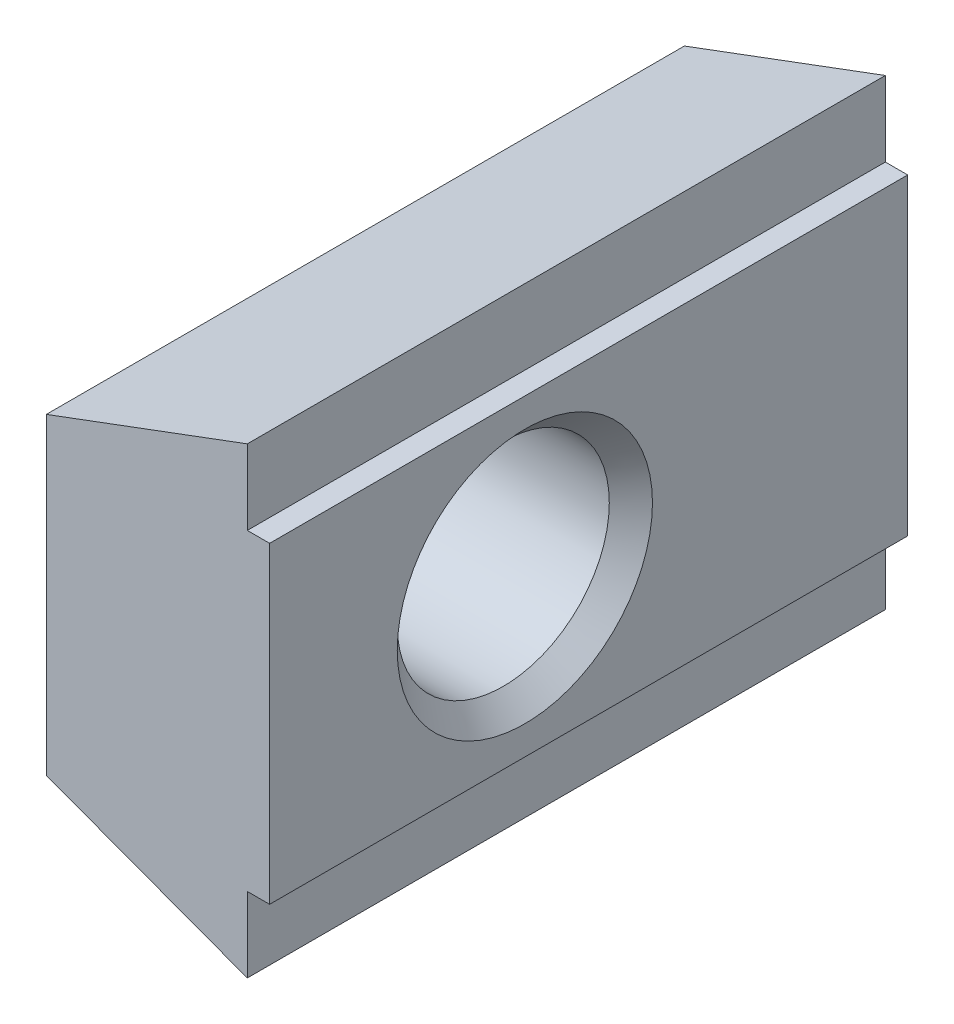
ISO-10303-21;
HEADER;
FILE_DESCRIPTION(('STEP AP214'),'2;1');
FILE_NAME('part.step','',(''),(''),'','','');
FILE_SCHEMA(('AUTOMOTIVE_DESIGN { 1 0 10303 214 1 1 1 1 }'));
ENDSEC;
DATA;
#1=APPLICATION_CONTEXT('core data for automotive mechanical design processes');
#2=APPLICATION_PROTOCOL_DEFINITION('international standard','automotive_design',2000,#1);
#3=PRODUCT_CONTEXT('',#1,'mechanical');
#4=PRODUCT('Part','Part','',(#3));
#5=PRODUCT_RELATED_PRODUCT_CATEGORY('part','',(#4));
#6=PRODUCT_DEFINITION_FORMATION('','',#4);
#7=PRODUCT_DEFINITION_CONTEXT('part definition',#1,'design');
#8=PRODUCT_DEFINITION('design','',#6,#7);
#9=PRODUCT_DEFINITION_SHAPE('','',#8);
#10=(LENGTH_UNIT() NAMED_UNIT(*) SI_UNIT(.MILLI.,.METRE.));
#11=(NAMED_UNIT(*) PLANE_ANGLE_UNIT() SI_UNIT($,.RADIAN.));
#12=(NAMED_UNIT(*) SI_UNIT($,.STERADIAN.) SOLID_ANGLE_UNIT());
#13=UNCERTAINTY_MEASURE_WITH_UNIT(LENGTH_MEASURE(1.E-05),#10,'distance_accuracy_value','');
#14=(GEOMETRIC_REPRESENTATION_CONTEXT(3) GLOBAL_UNCERTAINTY_ASSIGNED_CONTEXT((#13)) GLOBAL_UNIT_ASSIGNED_CONTEXT((#10,
#11,#12)) REPRESENTATION_CONTEXT('',''));
#15=CARTESIAN_POINT('',(0.,0.,0.));
#16=DIRECTION('',(0.,0.,1.));
#17=DIRECTION('',(1.,0.,0.));
#18=AXIS2_PLACEMENT_3D('',#15,#16,#17);
#19=CARTESIAN_POINT('',(1.3,0.,-5.));
#20=DIRECTION('',(1.,0.,0.));
#21=DIRECTION('',(0.,0.,-1.));
#22=AXIS2_PLACEMENT_3D('',#19,#20,#21);
#23=SPHERICAL_SURFACE('',#22,2.);
#24=CARTESIAN_POINT('',(-0.7,0.,-5.));
#25=VERTEX_POINT('',#24);
#26=VERTEX_LOOP('',#25);
#27=FACE_BOUND('',#26,.T.);
#28=CARTESIAN_POINT('',(0.,0.,-5.));
#29=DIRECTION('',(1.,0.,0.));
#30=DIRECTION('',(0.,0.,-1.));
#31=AXIS2_PLACEMENT_3D('',#28,#29,#30);
#32=CIRCLE('',#31,1.51986841535707);
#33=CARTESIAN_POINT('',(0.,0.,-6.51986841535707));
#34=VERTEX_POINT('',#33);
#35=EDGE_CURVE('E20',#34,#34,#32,.F.);
#36=ORIENTED_EDGE('',*,*,#35,.T.);
#37=EDGE_LOOP('',(#36));
#38=FACE_BOUND('',#37,.T.);
#39=ADVANCED_FACE('F16',(#27,#38),#23,.T.);
#40=CARTESIAN_POINT('',(-1.13686837721616E-10,0.,2.));
#41=DIRECTION('',(-1.,0.,0.));
#42=DIRECTION('',(0.,0.,1.));
#43=AXIS2_PLACEMENT_3D('',#40,#41,#42);
#44=CONICAL_SURFACE('',#43,4.00000000008549,0.785398163397448);
#45=CARTESIAN_POINT('',(-5.6843418860808E-11,0.,2.));
#46=DIRECTION('',(-1.,0.,0.));
#47=DIRECTION('',(0.,0.,1.));
#48=AXIS2_PLACEMENT_3D('',#45,#46,#47);
#49=CIRCLE('',#48,4.00000000002865);
#50=CARTESIAN_POINT('',(-5.6843418860808E-11,0.,6.00000000002865));
#51=VERTEX_POINT('',#50);
#52=EDGE_CURVE('E125',#51,#51,#49,.T.);
#53=ORIENTED_EDGE('',*,*,#52,.T.);
#54=EDGE_LOOP('',(#53));
#55=FACE_BOUND('',#54,.T.);
#56=CARTESIAN_POINT('',(0.6765,0.,2.));
#57=DIRECTION('',(-1.,0.,0.));
#58=DIRECTION('',(0.,0.,1.));
#59=AXIS2_PLACEMENT_3D('',#56,#57,#58);
#60=CIRCLE('',#59,3.3235);
#61=CARTESIAN_POINT('',(0.6765,0.,5.3235));
#62=VERTEX_POINT('',#61);
#63=EDGE_CURVE('E93',#62,#62,#60,.F.);
#64=ORIENTED_EDGE('',*,*,#63,.T.);
#65=EDGE_LOOP('',(#64));
#66=FACE_BOUND('',#65,.T.);
#67=ADVANCED_FACE('F135',(#55,#66),#44,.F.);
#68=CARTESIAN_POINT('',(0.,4.9,10.));
#69=DIRECTION('',(1.,0.,0.));
#70=DIRECTION('',(0.,0.,-1.));
#71=AXIS2_PLACEMENT_3D('',#68,#69,#70);
#72=PLANE('',#71);
#73=ORIENTED_EDGE('',*,*,#52,.F.);
#74=EDGE_LOOP('',(#73));
#75=FACE_BOUND('',#74,.T.);
#76=DIRECTION('',(0.,0.,1.));
#77=VECTOR('',#76,1.);
#78=CARTESIAN_POINT('',(0.,-4.9,10.));
#79=LINE('',#78,#77);
#80=CARTESIAN_POINT('',(0.,-4.9,-10.));
#81=VERTEX_POINT('',#80);
#82=CARTESIAN_POINT('',(0.,-4.9,10.));
#83=VERTEX_POINT('',#82);
#84=EDGE_CURVE('E107',#81,#83,#79,.T.);
#85=ORIENTED_EDGE('',*,*,#84,.T.);
#86=DIRECTION('',(0.,1.,0.));
#87=VECTOR('',#86,1.);
#88=CARTESIAN_POINT('',(0.,0.,10.));
#89=LINE('',#88,#87);
#90=CARTESIAN_POINT('',(0.,4.9,10.));
#91=VERTEX_POINT('',#90);
#92=EDGE_CURVE('E100',#91,#83,#89,.F.);
#93=ORIENTED_EDGE('',*,*,#92,.F.);
#94=DIRECTION('',(0.,0.,1.));
#95=VECTOR('',#94,1.);
#96=CARTESIAN_POINT('',(0.,4.9,10.));
#97=LINE('',#96,#95);
#98=CARTESIAN_POINT('',(0.,4.9,-10.));
#99=VERTEX_POINT('',#98);
#100=EDGE_CURVE('E84',#91,#99,#97,.F.);
#101=ORIENTED_EDGE('',*,*,#100,.T.);
#102=DIRECTION('',(0.,1.,0.));
#103=VECTOR('',#102,1.);
#104=CARTESIAN_POINT('',(0.,0.,-10.));
#105=LINE('',#104,#103);
#106=EDGE_CURVE('E205',#99,#81,#105,.F.);
#107=ORIENTED_EDGE('',*,*,#106,.T.);
#108=EDGE_LOOP('',(#85,#93,#101,#107));
#109=FACE_BOUND('',#108,.T.);
#110=ORIENTED_EDGE('',*,*,#35,.F.);
#111=EDGE_LOOP('',(#110));
#112=FACE_BOUND('',#111,.T.);
#113=ADVANCED_FACE('F105',(#75,#109,#112),#72,.F.);
#114=CARTESIAN_POINT('',(0.,-4.9,10.));
#115=DIRECTION('',(0.349493096333603,0.936938939107107,0.));
#116=DIRECTION('',(-0.936938939107107,0.349493096333603,0.));
#117=AXIS2_PLACEMENT_3D('',#114,#115,#116);
#118=PLANE('',#117);
#119=DIRECTION('',(0.,0.,1.));
#120=VECTOR('',#119,1.);
#121=CARTESIAN_POINT('',(6.3,-7.25,10.));
#122=LINE('',#121,#120);
#123=CARTESIAN_POINT('',(6.3,-7.25,-10.));
#124=VERTEX_POINT('',#123);
#125=CARTESIAN_POINT('',(6.3,-7.25,10.));
#126=VERTEX_POINT('',#125);
#127=EDGE_CURVE('E122',#124,#126,#122,.T.);
#128=ORIENTED_EDGE('',*,*,#127,.T.);
#129=DIRECTION('',(0.936938939107107,-0.349493096333603,0.));
#130=VECTOR('',#129,1.);
#131=CARTESIAN_POINT('',(0.,-4.9,10.));
#132=LINE('',#131,#130);
#133=EDGE_CURVE('E109',#83,#126,#132,.T.);
#134=ORIENTED_EDGE('',*,*,#133,.F.);
#135=ORIENTED_EDGE('',*,*,#84,.F.);
#136=DIRECTION('',(0.936938939107107,-0.349493096333603,0.));
#137=VECTOR('',#136,1.);
#138=CARTESIAN_POINT('',(0.,-4.9,-10.));
#139=LINE('',#138,#137);
#140=EDGE_CURVE('E207',#81,#124,#139,.T.);
#141=ORIENTED_EDGE('',*,*,#140,.T.);
#142=EDGE_LOOP('',(#128,#134,#135,#141));
#143=FACE_BOUND('',#142,.T.);
#144=ADVANCED_FACE('F134',(#143),#118,.F.);
#145=CARTESIAN_POINT('',(6.3,-7.25,10.));
#146=DIRECTION('',(-1.,0.,0.));
#147=DIRECTION('',(0.,0.,1.));
#148=AXIS2_PLACEMENT_3D('',#145,#146,#147);
#149=PLANE('',#148);
#150=DIRECTION('',(0.,0.,1.));
#151=VECTOR('',#150,1.);
#152=CARTESIAN_POINT('',(6.3,-4.9,10.));
#153=LINE('',#152,#151);
#154=CARTESIAN_POINT('',(6.3,-4.9,-10.));
#155=VERTEX_POINT('',#154);
#156=CARTESIAN_POINT('',(6.3,-4.9,10.));
#157=VERTEX_POINT('',#156);
#158=EDGE_CURVE('E103',#155,#157,#153,.T.);
#159=ORIENTED_EDGE('',*,*,#158,.T.);
#160=DIRECTION('',(0.,1.,0.));
#161=VECTOR('',#160,1.);
#162=CARTESIAN_POINT('',(6.3,0.,10.));
#163=LINE('',#162,#161);
#164=EDGE_CURVE('E111',#126,#157,#163,.T.);
#165=ORIENTED_EDGE('',*,*,#164,.F.);
#166=ORIENTED_EDGE('',*,*,#127,.F.);
#167=DIRECTION('',(0.,1.,0.));
#168=VECTOR('',#167,1.);
#169=CARTESIAN_POINT('',(6.3,0.,-10.));
#170=LINE('',#169,#168);
#171=EDGE_CURVE('E190',#124,#155,#170,.T.);
#172=ORIENTED_EDGE('',*,*,#171,.T.);
#173=EDGE_LOOP('',(#159,#165,#166,#172));
#174=FACE_BOUND('',#173,.T.);
#175=ADVANCED_FACE('F143',(#174),#149,.F.);
#176=CARTESIAN_POINT('',(6.3,4.9,10.));
#177=DIRECTION('',(-1.,0.,0.));
#178=DIRECTION('',(0.,0.,1.));
#179=AXIS2_PLACEMENT_3D('',#176,#177,#178);
#180=PLANE('',#179);
#181=DIRECTION('',(0.,0.,1.));
#182=VECTOR('',#181,1.);
#183=CARTESIAN_POINT('',(6.3,7.25,10.));
#184=LINE('',#183,#182);
#185=CARTESIAN_POINT('',(6.3,7.25,-10.));
#186=VERTEX_POINT('',#185);
#187=CARTESIAN_POINT('',(6.3,7.25,10.));
#188=VERTEX_POINT('',#187);
#189=EDGE_CURVE('E94',#186,#188,#184,.T.);
#190=ORIENTED_EDGE('',*,*,#189,.T.);
#191=DIRECTION('',(0.,1.,0.));
#192=VECTOR('',#191,1.);
#193=CARTESIAN_POINT('',(6.3,0.,10.));
#194=LINE('',#193,#192);
#195=CARTESIAN_POINT('',(6.3,4.9,10.));
#196=VERTEX_POINT('',#195);
#197=EDGE_CURVE('E102',#196,#188,#194,.T.);
#198=ORIENTED_EDGE('',*,*,#197,.F.);
#199=DIRECTION('',(0.,0.,-1.));
#200=VECTOR('',#199,1.);
#201=CARTESIAN_POINT('',(6.3,4.9,10.));
#202=LINE('',#201,#200);
#203=CARTESIAN_POINT('',(6.3,4.9,-10.));
#204=VERTEX_POINT('',#203);
#205=EDGE_CURVE('E203',#196,#204,#202,.T.);
#206=ORIENTED_EDGE('',*,*,#205,.T.);
#207=DIRECTION('',(0.,1.,0.));
#208=VECTOR('',#207,1.);
#209=CARTESIAN_POINT('',(6.3,0.,-10.));
#210=LINE('',#209,#208);
#211=EDGE_CURVE('E214',#204,#186,#210,.T.);
#212=ORIENTED_EDGE('',*,*,#211,.T.);
#213=EDGE_LOOP('',(#190,#198,#206,#212));
#214=FACE_BOUND('',#213,.T.);
#215=ADVANCED_FACE('F178',(#214),#180,.F.);
#216=CARTESIAN_POINT('',(6.3,7.25,10.));
#217=DIRECTION('',(0.349493096333603,-0.936938939107107,0.));
#218=DIRECTION('',(0.936938939107107,0.349493096333603,0.));
#219=AXIS2_PLACEMENT_3D('',#216,#217,#218);
#220=PLANE('',#219);
#221=ORIENTED_EDGE('',*,*,#100,.F.);
#222=DIRECTION('',(-0.936938939107107,-0.349493096333603,0.));
#223=VECTOR('',#222,1.);
#224=CARTESIAN_POINT('',(6.3,7.25,10.));
#225=LINE('',#224,#223);
#226=EDGE_CURVE('E87',#188,#91,#225,.T.);
#227=ORIENTED_EDGE('',*,*,#226,.F.);
#228=ORIENTED_EDGE('',*,*,#189,.F.);
#229=DIRECTION('',(-0.936938939107107,-0.349493096333603,0.));
#230=VECTOR('',#229,1.);
#231=CARTESIAN_POINT('',(6.3,7.25,-10.));
#232=LINE('',#231,#230);
#233=EDGE_CURVE('E89',#186,#99,#232,.T.);
#234=ORIENTED_EDGE('',*,*,#233,.T.);
#235=EDGE_LOOP('',(#221,#227,#228,#234));
#236=FACE_BOUND('',#235,.T.);
#237=ADVANCED_FACE('F86',(#236),#220,.F.);
#238=CARTESIAN_POINT('',(7.,0.,2.));
#239=DIRECTION('',(-1.,0.,0.));
#240=DIRECTION('',(0.,0.,1.));
#241=AXIS2_PLACEMENT_3D('',#238,#239,#240);
#242=CYLINDRICAL_SURFACE('',#241,3.3235);
#243=ORIENTED_EDGE('',*,*,#63,.F.);
#244=EDGE_LOOP('',(#243));
#245=FACE_BOUND('',#244,.T.);
#246=CARTESIAN_POINT('',(6.32349999995085,0.,2.));
#247=DIRECTION('',(1.,0.,0.));
#248=DIRECTION('',(0.,0.,-1.));
#249=AXIS2_PLACEMENT_3D('',#246,#247,#248);
#250=CIRCLE('',#249,3.3234999999554);
#251=CARTESIAN_POINT('',(6.32349999995085,0.,-1.3234999999554));
#252=VERTEX_POINT('',#251);
#253=EDGE_CURVE('E218',#252,#252,#250,.T.);
#254=ORIENTED_EDGE('',*,*,#253,.T.);
#255=EDGE_LOOP('',(#254));
#256=FACE_BOUND('',#255,.T.);
#257=ADVANCED_FACE('F171',(#245,#256),#242,.F.);
#258=CARTESIAN_POINT('',(6.3,-4.9,10.));
#259=DIRECTION('',(0.,1.,0.));
#260=DIRECTION('',(0.,0.,1.));
#261=AXIS2_PLACEMENT_3D('',#258,#259,#260);
#262=PLANE('',#261);
#263=DIRECTION('',(0.,0.,1.));
#264=VECTOR('',#263,1.);
#265=CARTESIAN_POINT('',(7.,-4.9,10.));
#266=LINE('',#265,#264);
#267=CARTESIAN_POINT('',(7.,-4.9,-10.));
#268=VERTEX_POINT('',#267);
#269=CARTESIAN_POINT('',(7.,-4.9,10.));
#270=VERTEX_POINT('',#269);
#271=EDGE_CURVE('E195',#268,#270,#266,.T.);
#272=ORIENTED_EDGE('',*,*,#271,.T.);
#273=DIRECTION('',(1.,0.,0.));
#274=VECTOR('',#273,1.);
#275=CARTESIAN_POINT('',(0.,-4.9,10.));
#276=LINE('',#275,#274);
#277=EDGE_CURVE('E194',#157,#270,#276,.T.);
#278=ORIENTED_EDGE('',*,*,#277,.F.);
#279=ORIENTED_EDGE('',*,*,#158,.F.);
#280=DIRECTION('',(1.,0.,0.));
#281=VECTOR('',#280,1.);
#282=CARTESIAN_POINT('',(0.,-4.9,-10.));
#283=LINE('',#282,#281);
#284=EDGE_CURVE('E211',#155,#268,#283,.T.);
#285=ORIENTED_EDGE('',*,*,#284,.T.);
#286=EDGE_LOOP('',(#272,#278,#279,#285));
#287=FACE_BOUND('',#286,.T.);
#288=ADVANCED_FACE('F168',(#287),#262,.F.);
#289=CARTESIAN_POINT('',(0.,0.,10.));
#290=DIRECTION('',(0.,0.,1.));
#291=DIRECTION('',(1.,0.,0.));
#292=AXIS2_PLACEMENT_3D('',#289,#290,#291);
#293=PLANE('',#292);
#294=DIRECTION('',(1.,0.,0.));
#295=VECTOR('',#294,1.);
#296=CARTESIAN_POINT('',(7.,4.9,10.));
#297=LINE('',#296,#295);
#298=CARTESIAN_POINT('',(7.,4.9,10.));
#299=VERTEX_POINT('',#298);
#300=EDGE_CURVE('E199',#299,#196,#297,.F.);
#301=ORIENTED_EDGE('',*,*,#300,.T.);
#302=ORIENTED_EDGE('',*,*,#197,.T.);
#303=ORIENTED_EDGE('',*,*,#226,.T.);
#304=ORIENTED_EDGE('',*,*,#92,.T.);
#305=ORIENTED_EDGE('',*,*,#133,.T.);
#306=ORIENTED_EDGE('',*,*,#164,.T.);
#307=ORIENTED_EDGE('',*,*,#277,.T.);
#308=DIRECTION('',(0.,1.,0.));
#309=VECTOR('',#308,1.);
#310=CARTESIAN_POINT('',(7.,-4.9,10.));
#311=LINE('',#310,#309);
#312=EDGE_CURVE('E224',#270,#299,#311,.T.);
#313=ORIENTED_EDGE('',*,*,#312,.T.);
#314=EDGE_LOOP('',(#301,#302,#303,#304,#305,#306,#307,#313));
#315=FACE_BOUND('',#314,.T.);
#316=ADVANCED_FACE('F99',(#315),#293,.T.);
#317=CARTESIAN_POINT('',(7.,4.9,10.));
#318=DIRECTION('',(0.,-1.,0.));
#319=DIRECTION('',(0.,0.,-1.));
#320=AXIS2_PLACEMENT_3D('',#317,#318,#319);
#321=PLANE('',#320);
#322=ORIENTED_EDGE('',*,*,#205,.F.);
#323=ORIENTED_EDGE('',*,*,#300,.F.);
#324=DIRECTION('',(0.,0.,1.));
#325=VECTOR('',#324,1.);
#326=CARTESIAN_POINT('',(7.,4.9,10.));
#327=LINE('',#326,#325);
#328=CARTESIAN_POINT('',(7.,4.9,-10.));
#329=VERTEX_POINT('',#328);
#330=EDGE_CURVE('E226',#299,#329,#327,.F.);
#331=ORIENTED_EDGE('',*,*,#330,.T.);
#332=DIRECTION('',(1.,0.,0.));
#333=VECTOR('',#332,1.);
#334=CARTESIAN_POINT('',(0.,4.9,-10.));
#335=LINE('',#334,#333);
#336=EDGE_CURVE('E35',#329,#204,#335,.F.);
#337=ORIENTED_EDGE('',*,*,#336,.T.);
#338=EDGE_LOOP('',(#322,#323,#331,#337));
#339=FACE_BOUND('',#338,.T.);
#340=ADVANCED_FACE('F162',(#339),#321,.F.);
#341=CARTESIAN_POINT('',(0.,0.,-10.));
#342=DIRECTION('',(0.,0.,1.));
#343=DIRECTION('',(1.,0.,0.));
#344=AXIS2_PLACEMENT_3D('',#341,#342,#343);
#345=PLANE('',#344);
#346=ORIENTED_EDGE('',*,*,#211,.F.);
#347=ORIENTED_EDGE('',*,*,#336,.F.);
#348=DIRECTION('',(0.,1.,0.));
#349=VECTOR('',#348,1.);
#350=CARTESIAN_POINT('',(7.,-4.9,-10.));
#351=LINE('',#350,#349);
#352=EDGE_CURVE('E26',#329,#268,#351,.F.);
#353=ORIENTED_EDGE('',*,*,#352,.T.);
#354=ORIENTED_EDGE('',*,*,#284,.F.);
#355=ORIENTED_EDGE('',*,*,#171,.F.);
#356=ORIENTED_EDGE('',*,*,#140,.F.);
#357=ORIENTED_EDGE('',*,*,#106,.F.);
#358=ORIENTED_EDGE('',*,*,#233,.F.);
#359=EDGE_LOOP('',(#346,#347,#353,#354,#355,#356,#357,#358));
#360=FACE_BOUND('',#359,.T.);
#361=ADVANCED_FACE('F154',(#360),#345,.F.);
#362=CARTESIAN_POINT('',(7.000000000005,0.,2.));
#363=DIRECTION('',(1.,0.,0.));
#364=DIRECTION('',(0.,0.,-1.));
#365=AXIS2_PLACEMENT_3D('',#362,#363,#364);
#366=CONICAL_SURFACE('',#365,4.00000000000955,0.785398163397448);
#367=ORIENTED_EDGE('',*,*,#253,.F.);
#368=EDGE_LOOP('',(#367));
#369=FACE_BOUND('',#368,.T.);
#370=CARTESIAN_POINT('',(7.000000000005,0.,2.));
#371=DIRECTION('',(1.,0.,0.));
#372=DIRECTION('',(0.,0.,-1.));
#373=AXIS2_PLACEMENT_3D('',#370,#371,#372);
#374=CIRCLE('',#373,4.00000000000955);
#375=CARTESIAN_POINT('',(7.000000000005,0.,-2.00000000000955));
#376=VERTEX_POINT('',#375);
#377=EDGE_CURVE('E11',#376,#376,#374,.T.);
#378=ORIENTED_EDGE('',*,*,#377,.T.);
#379=EDGE_LOOP('',(#378));
#380=FACE_BOUND('',#379,.T.);
#381=ADVANCED_FACE('F148',(#369,#380),#366,.F.);
#382=CARTESIAN_POINT('',(7.,-4.9,10.));
#383=DIRECTION('',(-1.,0.,0.));
#384=DIRECTION('',(0.,0.,1.));
#385=AXIS2_PLACEMENT_3D('',#382,#383,#384);
#386=PLANE('',#385);
#387=ORIENTED_EDGE('',*,*,#377,.F.);
#388=EDGE_LOOP('',(#387));
#389=FACE_BOUND('',#388,.T.);
#390=ORIENTED_EDGE('',*,*,#330,.F.);
#391=ORIENTED_EDGE('',*,*,#312,.F.);
#392=ORIENTED_EDGE('',*,*,#271,.F.);
#393=ORIENTED_EDGE('',*,*,#352,.F.);
#394=EDGE_LOOP('',(#390,#391,#392,#393));
#395=FACE_BOUND('',#394,.T.);
#396=ADVANCED_FACE('F146',(#389,#395),#386,.F.);
#397=CLOSED_SHELL('',(#39,#67,#113,#144,#175,#215,#237,#257,#288,#316,#340,#361,#381,#396));
#398=MANIFOLD_SOLID_BREP('B1',#397);
#399=ADVANCED_BREP_SHAPE_REPRESENTATION('',(#18,#398),#14);
#400=SHAPE_DEFINITION_REPRESENTATION(#9,#399);
ENDSEC;
END-ISO-10303-21;
